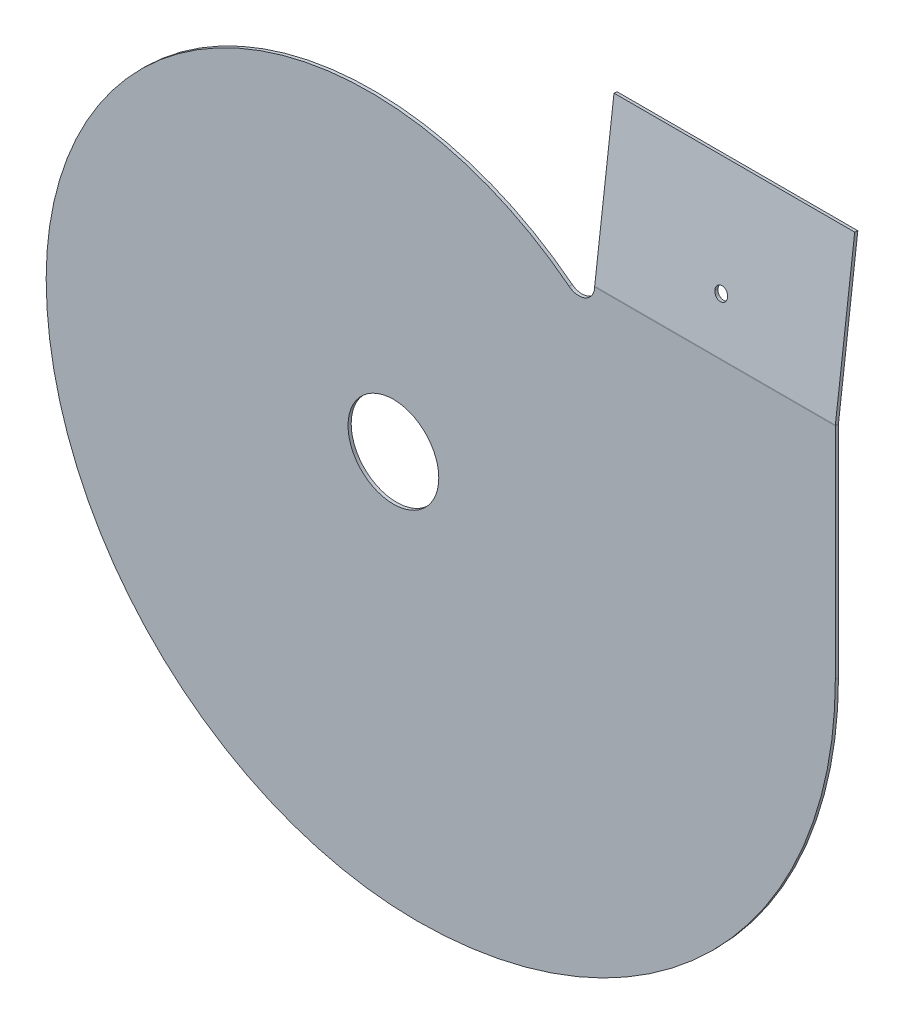
ISO-10303-21;
HEADER;
FILE_DESCRIPTION(('STEP AP214'),'2;1');
FILE_NAME('part.step','',(''),(''),'','','');
FILE_SCHEMA(('AUTOMOTIVE_DESIGN { 1 0 10303 214 1 1 1 1 }'));
ENDSEC;
DATA;
#1=APPLICATION_CONTEXT('core data for automotive mechanical design processes');
#2=APPLICATION_PROTOCOL_DEFINITION('international standard','automotive_design',2000,#1);
#3=PRODUCT_CONTEXT('',#1,'mechanical');
#4=PRODUCT('Part','Part','',(#3));
#5=PRODUCT_RELATED_PRODUCT_CATEGORY('part','',(#4));
#6=PRODUCT_DEFINITION_FORMATION('','',#4);
#7=PRODUCT_DEFINITION_CONTEXT('part definition',#1,'design');
#8=PRODUCT_DEFINITION('design','',#6,#7);
#9=PRODUCT_DEFINITION_SHAPE('','',#8);
#10=(LENGTH_UNIT() NAMED_UNIT(*) SI_UNIT(.MILLI.,.METRE.));
#11=(NAMED_UNIT(*) PLANE_ANGLE_UNIT() SI_UNIT($,.RADIAN.));
#12=(NAMED_UNIT(*) SI_UNIT($,.STERADIAN.) SOLID_ANGLE_UNIT());
#13=UNCERTAINTY_MEASURE_WITH_UNIT(LENGTH_MEASURE(1.E-05),#10,'distance_accuracy_value','');
#14=(GEOMETRIC_REPRESENTATION_CONTEXT(3) GLOBAL_UNCERTAINTY_ASSIGNED_CONTEXT((#13)) GLOBAL_UNIT_ASSIGNED_CONTEXT((#10,
#11,#12)) REPRESENTATION_CONTEXT('',''));
#15=CARTESIAN_POINT('',(0.,0.,0.));
#16=DIRECTION('',(0.,0.,1.));
#17=DIRECTION('',(1.,0.,0.));
#18=AXIS2_PLACEMENT_3D('',#15,#16,#17);
#19=CARTESIAN_POINT('',(255.,508.256089977836,-28.525118465794));
#20=DIRECTION('',(-1.,0.,0.));
#21=DIRECTION('',(0.,0.121869343405148,0.992546151641322));
#22=AXIS2_PLACEMENT_3D('',#19,#20,#21);
#23=PLANE('',#22);
#24=DIRECTION('',(0.,-0.992546151641322,0.121869343405148));
#25=VECTOR('',#24,1.);
#26=CARTESIAN_POINT('',(255.,508.256089977836,-28.525118465794));
#27=LINE('',#26,#25);
#28=CARTESIAN_POINT('',(255.,508.256089977836,-28.525118465794));
#29=VERTEX_POINT('',#28);
#30=CARTESIAN_POINT('',(255.,308.697149175057,-4.02236154507604));
#31=VERTEX_POINT('',#30);
#32=EDGE_CURVE('E370',#29,#31,#27,.T.);
#33=ORIENTED_EDGE('',*,*,#32,.T.);
#34=DIRECTION('',(0.,0.121869343405148,0.992546151641322));
#35=VECTOR('',#34,1.);
#36=CARTESIAN_POINT('',(255.,308.697149175057,-4.02236154507604));
#37=LINE('',#36,#35);
#38=CARTESIAN_POINT('',(255.,309.184626548678,-0.0521769385107493));
#39=VERTEX_POINT('',#38);
#40=EDGE_CURVE('E12',#31,#39,#37,.T.);
#41=ORIENTED_EDGE('',*,*,#40,.T.);
#42=DIRECTION('',(0.,-0.992546151641322,0.121869343405148));
#43=VECTOR('',#42,1.);
#44=CARTESIAN_POINT('',(255.,508.743567351456,-24.5549338592287));
#45=LINE('',#44,#43);
#46=CARTESIAN_POINT('',(255.,508.743567351456,-24.5549338592287));
#47=VERTEX_POINT('',#46);
#48=EDGE_CURVE('E421',#47,#39,#45,.T.);
#49=ORIENTED_EDGE('',*,*,#48,.F.);
#50=DIRECTION('',(0.,0.121869343405148,0.992546151641322));
#51=VECTOR('',#50,1.);
#52=CARTESIAN_POINT('',(255.,508.256089977836,-28.525118465794));
#53=LINE('',#52,#51);
#54=EDGE_CURVE('E374',#29,#47,#53,.T.);
#55=ORIENTED_EDGE('',*,*,#54,.F.);
#56=EDGE_LOOP('',(#33,#41,#49,#55));
#57=FACE_BOUND('',#56,.T.);
#58=ADVANCED_FACE('F49',(#57),#23,.T.);
#59=CARTESIAN_POINT('',(560.,31.8339371900013,29.9721663686769));
#60=DIRECTION('',(1.,0.,0.));
#61=DIRECTION('',(0.,-0.121869343405148,-0.992546151641322));
#62=AXIS2_PLACEMENT_3D('',#59,#60,#61);
#63=PLANE('',#62);
#64=DIRECTION('',(0.,0.992546151641322,-0.121869343405148));
#65=VECTOR('',#64,1.);
#66=CARTESIAN_POINT('',(560.,32.3214145636219,33.9423509752422));
#67=LINE('',#66,#65);
#68=CARTESIAN_POINT('',(560.,309.184626548678,-0.0521769385107493));
#69=VERTEX_POINT('',#68);
#70=CARTESIAN_POINT('',(560.,508.743567351456,-24.5549338592287));
#71=VERTEX_POINT('',#70);
#72=EDGE_CURVE('E283',#69,#71,#67,.T.);
#73=ORIENTED_EDGE('',*,*,#72,.F.);
#74=DIRECTION('',(0.,-0.121869343405148,-0.992546151641322));
#75=VECTOR('',#74,1.);
#76=CARTESIAN_POINT('',(560.,308.697149175057,-4.02236154507604));
#77=LINE('',#76,#75);
#78=CARTESIAN_POINT('',(560.,308.697149175057,-4.02236154507603));
#79=VERTEX_POINT('',#78);
#80=EDGE_CURVE('E395',#69,#79,#77,.T.);
#81=ORIENTED_EDGE('',*,*,#80,.T.);
#82=DIRECTION('',(0.,0.992546151641322,-0.121869343405148));
#83=VECTOR('',#82,1.);
#84=CARTESIAN_POINT('',(560.,31.8339371900013,29.9721663686769));
#85=LINE('',#84,#83);
#86=CARTESIAN_POINT('',(560.,508.256089977836,-28.525118465794));
#87=VERTEX_POINT('',#86);
#88=EDGE_CURVE('E52',#79,#87,#85,.T.);
#89=ORIENTED_EDGE('',*,*,#88,.T.);
#90=DIRECTION('',(0.,0.121869343405148,0.992546151641322));
#91=VECTOR('',#90,1.);
#92=CARTESIAN_POINT('',(560.,508.256089977836,-28.525118465794));
#93=LINE('',#92,#91);
#94=EDGE_CURVE('E378',#87,#71,#93,.T.);
#95=ORIENTED_EDGE('',*,*,#94,.T.);
#96=EDGE_LOOP('',(#73,#81,#89,#95));
#97=FACE_BOUND('',#96,.T.);
#98=ADVANCED_FACE('F358',(#97),#63,.T.);
#99=CARTESIAN_POINT('',(-30.,-27.2313545348574,41.2545115795511));
#100=DIRECTION('',(0.,0.121869343405148,0.992546151641322));
#101=DIRECTION('',(1.,0.,0.));
#102=AXIS2_PLACEMENT_3D('',#99,#100,#101);
#103=PLANE('',#102);
#104=CARTESIAN_POINT('',(407.5,373.,-7.88771954658621));
#105=DIRECTION('',(0.,0.121869343405148,0.992546151641322));
#106=DIRECTION('',(0.,0.992546151641322,-0.121869343405148));
#107=AXIS2_PLACEMENT_3D('',#104,#105,#106);
#108=ELLIPSE('',#107,8.06007860367077,7.99999999999999);
#109=CARTESIAN_POINT('',(415.496286103721,373.243738686815,-7.91764689422182));
#110=VERTEX_POINT('',#109);
#111=CARTESIAN_POINT('',(399.50371389628,373.243738686815,-7.91764689422182));
#112=VERTEX_POINT('',#111);
#113=EDGE_CURVE('E65',#110,#112,#108,.F.);
#114=ORIENTED_EDGE('',*,*,#113,.T.);
#115=CARTESIAN_POINT('',(407.5,373.487477373621,-7.94757424185634));
#116=DIRECTION('',(0.,0.121869343405148,0.992546151641322));
#117=DIRECTION('',(0.,0.992546151641322,-0.121869343405148));
#118=AXIS2_PLACEMENT_3D('',#115,#116,#117);
#119=ELLIPSE('',#118,8.06007860367077,7.99999999999999);
#120=EDGE_CURVE('E150',#112,#110,#119,.F.);
#121=ORIENTED_EDGE('',*,*,#120,.T.);
#122=EDGE_LOOP('',(#114,#121));
#123=FACE_BOUND('',#122,.T.);
#124=ORIENTED_EDGE('',*,*,#48,.T.);
#125=DIRECTION('',(1.,0.,0.));
#126=VECTOR('',#125,1.);
#127=CARTESIAN_POINT('',(-30.0000000000001,309.184626548678,-0.0521769385107493));
#128=LINE('',#127,#126);
#129=EDGE_CURVE('E57',#39,#69,#128,.T.);
#130=ORIENTED_EDGE('',*,*,#129,.T.);
#131=ORIENTED_EDGE('',*,*,#72,.T.);
#132=DIRECTION('',(-1.,0.,0.));
#133=VECTOR('',#132,1.);
#134=CARTESIAN_POINT('',(560.,508.743567351456,-24.5549338592287));
#135=LINE('',#134,#133);
#136=EDGE_CURVE('E418',#71,#47,#135,.T.);
#137=ORIENTED_EDGE('',*,*,#136,.T.);
#138=EDGE_LOOP('',(#124,#130,#131,#137));
#139=FACE_BOUND('',#138,.T.);
#140=ADVANCED_FACE('F155',(#123,#139),#103,.T.);
#141=CARTESIAN_POINT('',(560.,508.256089977836,-28.525118465794));
#142=DIRECTION('',(0.,0.992546151641322,-0.121869343405148));
#143=DIRECTION('',(0.,0.121869343405148,0.992546151641322));
#144=AXIS2_PLACEMENT_3D('',#141,#142,#143);
#145=PLANE('',#144);
#146=ORIENTED_EDGE('',*,*,#136,.F.);
#147=ORIENTED_EDGE('',*,*,#94,.F.);
#148=DIRECTION('',(-1.,0.,0.));
#149=VECTOR('',#148,1.);
#150=CARTESIAN_POINT('',(560.,508.256089977836,-28.525118465794));
#151=LINE('',#150,#149);
#152=EDGE_CURVE('E379',#87,#29,#151,.T.);
#153=ORIENTED_EDGE('',*,*,#152,.T.);
#154=ORIENTED_EDGE('',*,*,#54,.T.);
#155=EDGE_LOOP('',(#146,#147,#153,#154));
#156=FACE_BOUND('',#155,.T.);
#157=ADVANCED_FACE('F350',(#156),#145,.T.);
#158=CARTESIAN_POINT('',(-30.,-27.718831908478,37.2843269729858));
#159=DIRECTION('',(0.,0.121869343405148,0.992546151641322));
#160=DIRECTION('',(1.,0.,0.));
#161=AXIS2_PLACEMENT_3D('',#158,#159,#160);
#162=PLANE('',#161);
#163=CARTESIAN_POINT('',(407.5,373.,-11.9177588484216));
#164=DIRECTION('',(0.,0.121869343405148,0.992546151641322));
#165=DIRECTION('',(0.,0.992546151641322,-0.121869343405148));
#166=AXIS2_PLACEMENT_3D('',#163,#164,#165);
#167=ELLIPSE('',#166,8.06007860367077,7.99999999999999);
#168=CARTESIAN_POINT('',(399.50371389628,372.756261313194,-11.8878315007871));
#169=VERTEX_POINT('',#168);
#170=CARTESIAN_POINT('',(415.49628610372,372.756261313194,-11.8878315007871));
#171=VERTEX_POINT('',#170);
#172=EDGE_CURVE('E153',#169,#171,#167,.F.);
#173=ORIENTED_EDGE('',*,*,#172,.F.);
#174=CARTESIAN_POINT('',(407.5,372.512522626379,-11.8579041531515));
#175=DIRECTION('',(0.,0.121869343405148,0.992546151641322));
#176=DIRECTION('',(0.,0.992546151641322,-0.121869343405148));
#177=AXIS2_PLACEMENT_3D('',#174,#175,#176);
#178=ELLIPSE('',#177,8.06007860367077,7.99999999999999);
#179=EDGE_CURVE('E70',#171,#169,#178,.F.);
#180=ORIENTED_EDGE('',*,*,#179,.F.);
#181=EDGE_LOOP('',(#173,#180));
#182=FACE_BOUND('',#181,.T.);
#183=DIRECTION('',(1.,0.,0.));
#184=VECTOR('',#183,1.);
#185=CARTESIAN_POINT('',(-30.0000000000001,308.697149175057,-4.02236154507604));
#186=LINE('',#185,#184);
#187=EDGE_CURVE('E384',#31,#79,#186,.T.);
#188=ORIENTED_EDGE('',*,*,#187,.F.);
#189=ORIENTED_EDGE('',*,*,#32,.F.);
#190=ORIENTED_EDGE('',*,*,#152,.F.);
#191=ORIENTED_EDGE('',*,*,#88,.F.);
#192=EDGE_LOOP('',(#188,#189,#190,#191));
#193=FACE_BOUND('',#192,.T.);
#194=ADVANCED_FACE('F353',(#182,#193),#162,.F.);
#195=CARTESIAN_POINT('',(-30.,-30.,-4.));
#196=DIRECTION('',(0.,0.,1.));
#197=DIRECTION('',(1.,0.,0.));
#198=AXIS2_PLACEMENT_3D('',#195,#196,#197);
#199=CYLINDRICAL_SURFACE('',#198,410.);
#200=CARTESIAN_POINT('',(-30.,-30.,0.));
#201=DIRECTION('',(0.,0.,1.));
#202=DIRECTION('',(1.,0.,0.));
#203=AXIS2_PLACEMENT_3D('',#200,#201,#202);
#204=CIRCLE('',#203,410.);
#205=CARTESIAN_POINT('',(222.674418604651,292.886416844688,0.));
#206=VERTEX_POINT('',#205);
#207=CARTESIAN_POINT('',(-440.,-29.9999999999999,0.));
#208=VERTEX_POINT('',#207);
#209=EDGE_CURVE('E293',#206,#208,#204,.T.);
#210=ORIENTED_EDGE('',*,*,#209,.F.);
#211=DIRECTION('',(0.,0.,1.));
#212=VECTOR('',#211,1.);
#213=CARTESIAN_POINT('',(222.674418604651,292.886416844688,-4.));
#214=LINE('',#213,#212);
#215=CARTESIAN_POINT('',(222.674418604651,292.886416844688,-4.));
#216=VERTEX_POINT('',#215);
#217=EDGE_CURVE('E275',#216,#206,#214,.T.);
#218=ORIENTED_EDGE('',*,*,#217,.F.);
#219=CARTESIAN_POINT('',(-30.,-30.,-4.));
#220=DIRECTION('',(0.,0.,1.));
#221=DIRECTION('',(1.,0.,0.));
#222=AXIS2_PLACEMENT_3D('',#219,#220,#221);
#223=CIRCLE('',#222,410.);
#224=CARTESIAN_POINT('',(-440.,-29.9999999999999,-4.));
#225=VERTEX_POINT('',#224);
#226=EDGE_CURVE('E318',#216,#225,#223,.T.);
#227=ORIENTED_EDGE('',*,*,#226,.T.);
#228=DIRECTION('',(0.,0.,1.));
#229=VECTOR('',#228,1.);
#230=CARTESIAN_POINT('',(-440.,-29.9999999999999,-4.));
#231=LINE('',#230,#229);
#232=EDGE_CURVE('E316',#225,#208,#231,.T.);
#233=ORIENTED_EDGE('',*,*,#232,.T.);
#234=EDGE_LOOP('',(#210,#218,#227,#233));
#235=FACE_BOUND('',#234,.T.);
#236=ADVANCED_FACE('F234',(#235),#199,.T.);
#237=CARTESIAN_POINT('',(30.,-30.,-4.));
#238=DIRECTION('',(0.,0.,1.));
#239=DIRECTION('',(1.,0.,0.));
#240=AXIS2_PLACEMENT_3D('',#237,#238,#239);
#241=CYLINDRICAL_SURFACE('',#240,470.);
#242=CARTESIAN_POINT('',(30.,-30.,0.));
#243=DIRECTION('',(0.,0.,1.));
#244=DIRECTION('',(1.,0.,0.));
#245=AXIS2_PLACEMENT_3D('',#242,#243,#244);
#246=CIRCLE('',#245,470.);
#247=CARTESIAN_POINT('',(29.9999999999999,-500.,0.));
#248=VERTEX_POINT('',#247);
#249=EDGE_CURVE('E290',#208,#248,#246,.T.);
#250=ORIENTED_EDGE('',*,*,#249,.F.);
#251=ORIENTED_EDGE('',*,*,#232,.F.);
#252=CARTESIAN_POINT('',(30.,-30.,-4.));
#253=DIRECTION('',(0.,0.,1.));
#254=DIRECTION('',(1.,0.,0.));
#255=AXIS2_PLACEMENT_3D('',#252,#253,#254);
#256=CIRCLE('',#255,470.);
#257=CARTESIAN_POINT('',(29.9999999999999,-500.,-4.));
#258=VERTEX_POINT('',#257);
#259=EDGE_CURVE('E313',#225,#258,#256,.T.);
#260=ORIENTED_EDGE('',*,*,#259,.T.);
#261=DIRECTION('',(0.,0.,1.));
#262=VECTOR('',#261,1.);
#263=CARTESIAN_POINT('',(29.9999999999999,-500.,-4.));
#264=LINE('',#263,#262);
#265=EDGE_CURVE('E311',#258,#248,#264,.T.);
#266=ORIENTED_EDGE('',*,*,#265,.T.);
#267=EDGE_LOOP('',(#250,#251,#260,#266));
#268=FACE_BOUND('',#267,.T.);
#269=ADVANCED_FACE('F435',(#268),#241,.T.);
#270=CARTESIAN_POINT('',(30.,30.,-4.));
#271=DIRECTION('',(0.,0.,1.));
#272=DIRECTION('',(1.,0.,0.));
#273=AXIS2_PLACEMENT_3D('',#270,#271,#272);
#274=CYLINDRICAL_SURFACE('',#273,530.);
#275=CARTESIAN_POINT('',(30.,30.,0.));
#276=DIRECTION('',(0.,0.,1.));
#277=DIRECTION('',(1.,0.,0.));
#278=AXIS2_PLACEMENT_3D('',#275,#276,#277);
#279=CIRCLE('',#278,530.);
#280=CARTESIAN_POINT('',(560.,30.,0.));
#281=VERTEX_POINT('',#280);
#282=EDGE_CURVE('E287',#248,#281,#279,.T.);
#283=ORIENTED_EDGE('',*,*,#282,.F.);
#284=ORIENTED_EDGE('',*,*,#265,.F.);
#285=CARTESIAN_POINT('',(30.,30.,-4.));
#286=DIRECTION('',(0.,0.,1.));
#287=DIRECTION('',(1.,0.,0.));
#288=AXIS2_PLACEMENT_3D('',#285,#286,#287);
#289=CIRCLE('',#288,530.);
#290=CARTESIAN_POINT('',(560.,30.,-4.));
#291=VERTEX_POINT('',#290);
#292=EDGE_CURVE('E308',#258,#291,#289,.T.);
#293=ORIENTED_EDGE('',*,*,#292,.T.);
#294=DIRECTION('',(0.,0.,1.));
#295=VECTOR('',#294,1.);
#296=CARTESIAN_POINT('',(560.,30.,-4.));
#297=LINE('',#296,#295);
#298=EDGE_CURVE('E306',#291,#281,#297,.T.);
#299=ORIENTED_EDGE('',*,*,#298,.T.);
#300=EDGE_LOOP('',(#283,#284,#293,#299));
#301=FACE_BOUND('',#300,.T.);
#302=ADVANCED_FACE('F437',(#301),#274,.T.);
#303=CARTESIAN_POINT('',(0.,0.,6.));
#304=DIRECTION('',(0.,0.,-1.));
#305=DIRECTION('',(-1.,0.,0.));
#306=AXIS2_PLACEMENT_3D('',#303,#304,#305);
#307=CYLINDRICAL_SURFACE('',#306,57.5);
#308=CARTESIAN_POINT('',(0.,0.,0.));
#309=DIRECTION('',(0.,0.,1.));
#310=DIRECTION('',(1.,0.,0.));
#311=AXIS2_PLACEMENT_3D('',#308,#309,#310);
#312=CIRCLE('',#311,57.5);
#313=CARTESIAN_POINT('',(57.5,0.,0.));
#314=VERTEX_POINT('',#313);
#315=EDGE_CURVE('E303',#314,#314,#312,.T.);
#316=ORIENTED_EDGE('',*,*,#315,.T.);
#317=EDGE_LOOP('',(#316));
#318=FACE_BOUND('',#317,.T.);
#319=CARTESIAN_POINT('',(0.,0.,-4.));
#320=DIRECTION('',(0.,0.,-1.));
#321=DIRECTION('',(-1.,0.,0.));
#322=AXIS2_PLACEMENT_3D('',#319,#320,#321);
#323=CIRCLE('',#322,57.5);
#324=CARTESIAN_POINT('',(-57.5,0.,-4.));
#325=VERTEX_POINT('',#324);
#326=EDGE_CURVE('E300',#325,#325,#323,.T.);
#327=ORIENTED_EDGE('',*,*,#326,.T.);
#328=EDGE_LOOP('',(#327));
#329=FACE_BOUND('',#328,.T.);
#330=ADVANCED_FACE('F439',(#318,#329),#307,.F.);
#331=CARTESIAN_POINT('',(-30.,-30.,-4.));
#332=DIRECTION('',(0.,0.,1.));
#333=DIRECTION('',(1.,0.,0.));
#334=AXIS2_PLACEMENT_3D('',#331,#332,#333);
#335=PLANE('',#334);
#336=ORIENTED_EDGE('',*,*,#326,.F.);
#337=EDGE_LOOP('',(#336));
#338=FACE_BOUND('',#337,.T.);
#339=CARTESIAN_POINT('',(235.,308.636973763941,-4.));
#340=DIRECTION('',(0.,0.,-1.));
#341=DIRECTION('',(1.,0.,0.));
#342=AXIS2_PLACEMENT_3D('',#339,#340,#341);
#343=CIRCLE('',#342,20.);
#344=CARTESIAN_POINT('',(254.997667636882,308.331541144842,-4.));
#345=VERTEX_POINT('',#344);
#346=EDGE_CURVE('E284',#345,#216,#343,.T.);
#347=ORIENTED_EDGE('',*,*,#346,.F.);
#348=DIRECTION('',(1.,0.,0.));
#349=VECTOR('',#348,1.);
#350=CARTESIAN_POINT('',(-30.0000000000001,308.331541144842,-4.));
#351=LINE('',#350,#349);
#352=CARTESIAN_POINT('',(560.,308.331541144842,-4.));
#353=VERTEX_POINT('',#352);
#354=EDGE_CURVE('E299',#345,#353,#351,.T.);
#355=ORIENTED_EDGE('',*,*,#354,.T.);
#356=DIRECTION('',(0.,1.,0.));
#357=VECTOR('',#356,1.);
#358=CARTESIAN_POINT('',(560.,30.,-4.));
#359=LINE('',#358,#357);
#360=EDGE_CURVE('E297',#291,#353,#359,.T.);
#361=ORIENTED_EDGE('',*,*,#360,.F.);
#362=ORIENTED_EDGE('',*,*,#292,.F.);
#363=ORIENTED_EDGE('',*,*,#259,.F.);
#364=ORIENTED_EDGE('',*,*,#226,.F.);
#365=EDGE_LOOP('',(#347,#355,#361,#362,#363,#364));
#366=FACE_BOUND('',#365,.T.);
#367=ADVANCED_FACE('F408',(#338,#366),#335,.F.);
#368=CARTESIAN_POINT('',(560.,30.,-4.));
#369=DIRECTION('',(1.,0.,0.));
#370=DIRECTION('',(0.,0.,-1.));
#371=AXIS2_PLACEMENT_3D('',#368,#369,#370);
#372=PLANE('',#371);
#373=DIRECTION('',(0.,0.,-1.));
#374=VECTOR('',#373,1.);
#375=CARTESIAN_POINT('',(560.,308.331541144842,-4.));
#376=LINE('',#375,#374);
#377=CARTESIAN_POINT('',(560.,308.331541144842,0.));
#378=VERTEX_POINT('',#377);
#379=EDGE_CURVE('E321',#378,#353,#376,.T.);
#380=ORIENTED_EDGE('',*,*,#379,.F.);
#381=DIRECTION('',(0.,1.,0.));
#382=VECTOR('',#381,1.);
#383=CARTESIAN_POINT('',(560.,30.,0.));
#384=LINE('',#383,#382);
#385=EDGE_CURVE('E285',#281,#378,#384,.T.);
#386=ORIENTED_EDGE('',*,*,#385,.F.);
#387=ORIENTED_EDGE('',*,*,#298,.F.);
#388=ORIENTED_EDGE('',*,*,#360,.T.);
#389=EDGE_LOOP('',(#380,#386,#387,#388));
#390=FACE_BOUND('',#389,.T.);
#391=ADVANCED_FACE('F403',(#390),#372,.T.);
#392=CARTESIAN_POINT('',(-30.,-30.,0.));
#393=DIRECTION('',(0.,0.,1.));
#394=DIRECTION('',(1.,0.,0.));
#395=AXIS2_PLACEMENT_3D('',#392,#393,#394);
#396=PLANE('',#395);
#397=DIRECTION('',(1.,0.,0.));
#398=VECTOR('',#397,1.);
#399=CARTESIAN_POINT('',(-30.0000000000001,308.331541144842,0.));
#400=LINE('',#399,#398);
#401=CARTESIAN_POINT('',(254.997667636882,308.331541144842,0.));
#402=VERTEX_POINT('',#401);
#403=EDGE_CURVE('E324',#402,#378,#400,.T.);
#404=ORIENTED_EDGE('',*,*,#403,.F.);
#405=CARTESIAN_POINT('',(235.,308.636973763941,0.));
#406=DIRECTION('',(0.,0.,-1.));
#407=DIRECTION('',(1.,0.,0.));
#408=AXIS2_PLACEMENT_3D('',#405,#406,#407);
#409=CIRCLE('',#408,20.);
#410=EDGE_CURVE('E296',#402,#206,#409,.T.);
#411=ORIENTED_EDGE('',*,*,#410,.T.);
#412=ORIENTED_EDGE('',*,*,#209,.T.);
#413=ORIENTED_EDGE('',*,*,#249,.T.);
#414=ORIENTED_EDGE('',*,*,#282,.T.);
#415=ORIENTED_EDGE('',*,*,#385,.T.);
#416=EDGE_LOOP('',(#404,#411,#412,#413,#414,#415));
#417=FACE_BOUND('',#416,.T.);
#418=ORIENTED_EDGE('',*,*,#315,.F.);
#419=EDGE_LOOP('',(#418));
#420=FACE_BOUND('',#419,.T.);
#421=ADVANCED_FACE('F348',(#417,#420),#396,.T.);
#422=CARTESIAN_POINT('',(235.,308.636973763941,-4.));
#423=DIRECTION('',(0.,0.,1.));
#424=DIRECTION('',(1.,0.,0.));
#425=AXIS2_PLACEMENT_3D('',#422,#423,#424);
#426=CYLINDRICAL_SURFACE('',#425,20.);
#427=CARTESIAN_POINT('',(254.997667636882,308.331541144842,-4.));
#428=CARTESIAN_POINT('',(254.997667636882,308.331541144842,0.));
#429=B_SPLINE_CURVE_WITH_KNOTS('',1,(#427,#428),.UNSPECIFIED.,.F.,.F.,(2,2),(0.,1.),.UNSPECIFIED.);
#430=EDGE_CURVE('E271',#345,#402,#429,.T.);
#431=ORIENTED_EDGE('',*,*,#430,.F.);
#432=ORIENTED_EDGE('',*,*,#346,.T.);
#433=ORIENTED_EDGE('',*,*,#217,.T.);
#434=ORIENTED_EDGE('',*,*,#410,.F.);
#435=EDGE_LOOP('',(#431,#432,#433,#434));
#436=FACE_BOUND('',#435,.T.);
#437=ADVANCED_FACE('F338',(#436),#426,.F.);
#438=CARTESIAN_POINT('',(255.,308.331541144842,-7.));
#439=DIRECTION('',(1.,0.,0.));
#440=DIRECTION('',(0.,0.,-1.));
#441=AXIS2_PLACEMENT_3D('',#438,#439,#440);
#442=PLANE('',#441);
#443=CARTESIAN_POINT('',(255.,308.758880921586,-0.0130564110469369));
#444=CARTESIAN_POINT('',(255.,308.514686763446,-4.0055956047344));
#445=B_SPLINE_CURVE_WITH_KNOTS('',1,(#443,#444),.UNSPECIFIED.,.F.,.F.,(2,2),(0.,1.),.UNSPECIFIED.);
#446=CARTESIAN_POINT('',(255.,308.758880921586,-0.0130564110469291));
#447=VERTEX_POINT('',#446);
#448=CARTESIAN_POINT('',(255.,308.514686763446,-4.0055956047344));
#449=VERTEX_POINT('',#448);
#450=EDGE_CURVE('E261',#447,#449,#445,.T.);
#451=ORIENTED_EDGE('',*,*,#450,.F.);
#452=CARTESIAN_POINT('',(255.,308.331541144842,-7.));
#453=DIRECTION('',(1.,0.,0.));
#454=DIRECTION('',(0.,1.,0.));
#455=AXIS2_PLACEMENT_3D('',#452,#453,#454);
#456=CIRCLE('',#455,7.);
#457=EDGE_CURVE('E158',#447,#39,#456,.F.);
#458=ORIENTED_EDGE('',*,*,#457,.T.);
#459=ORIENTED_EDGE('',*,*,#40,.F.);
#460=CARTESIAN_POINT('',(255.,308.331541144842,-7.));
#461=DIRECTION('',(-1.,0.,0.));
#462=DIRECTION('',(0.,0.,-1.));
#463=AXIS2_PLACEMENT_3D('',#460,#461,#462);
#464=CIRCLE('',#463,3.);
#465=EDGE_CURVE('E381',#449,#31,#464,.T.);
#466=ORIENTED_EDGE('',*,*,#465,.F.);
#467=EDGE_LOOP('',(#451,#458,#459,#466));
#468=FACE_BOUND('',#467,.T.);
#469=ADVANCED_FACE('F232',(#468),#442,.F.);
#470=CARTESIAN_POINT('',(560.,308.331541144842,-7.));
#471=DIRECTION('',(-1.,0.,0.));
#472=DIRECTION('',(0.,0.,1.));
#473=AXIS2_PLACEMENT_3D('',#470,#471,#472);
#474=PLANE('',#473);
#475=ORIENTED_EDGE('',*,*,#80,.F.);
#476=CARTESIAN_POINT('',(560.,308.331541144842,-7.));
#477=DIRECTION('',(1.,0.,0.));
#478=DIRECTION('',(0.,1.,0.));
#479=AXIS2_PLACEMENT_3D('',#476,#477,#478);
#480=CIRCLE('',#479,7.);
#481=EDGE_CURVE('E386',#69,#378,#480,.T.);
#482=ORIENTED_EDGE('',*,*,#481,.T.);
#483=ORIENTED_EDGE('',*,*,#379,.T.);
#484=CARTESIAN_POINT('',(560.,308.331541144842,-7.));
#485=DIRECTION('',(1.,0.,0.));
#486=DIRECTION('',(0.,0.,1.));
#487=AXIS2_PLACEMENT_3D('',#484,#485,#486);
#488=CIRCLE('',#487,3.);
#489=EDGE_CURVE('E163',#79,#353,#488,.T.);
#490=ORIENTED_EDGE('',*,*,#489,.F.);
#491=EDGE_LOOP('',(#475,#482,#483,#490));
#492=FACE_BOUND('',#491,.T.);
#493=ADVANCED_FACE('F231',(#492),#474,.F.);
#494=CARTESIAN_POINT('',(254.997667636882,308.331541144842,0.));
#495=CARTESIAN_POINT('',(254.998445091585,308.474076427714,0.));
#496=CARTESIAN_POINT('',(254.999222545297,308.616611495749,-0.00435484019544299));
#497=CARTESIAN_POINT('',(255.,308.758880921586,-0.0130564110469369));
#498=CARTESIAN_POINT('',(254.997667636882,308.331541144842,-4.));
#499=CARTESIAN_POINT('',(254.998445091585,308.392627694641,-4.));
#500=CARTESIAN_POINT('',(254.999222545297,308.453714152377,-4.00186636008396));
#501=CARTESIAN_POINT('',(255.,308.514686763446,-4.0055956047344));
#502=B_SPLINE_SURFACE_WITH_KNOTS('',1,3,((#494,#495,#496,#497),(#498,#499,#500,#501)),
.UNSPECIFIED.,.F.,.F.,.F.,(2,2),(4,4),(0.,1.),(0.,1.),.UNSPECIFIED.);
#503=CARTESIAN_POINT('',(254.997667636882,308.331541144842,0.));
#504=CARTESIAN_POINT('',(254.998445091585,308.474076427714,0.));
#505=CARTESIAN_POINT('',(254.999222545297,308.616611495749,-0.00435484019544299));
#506=CARTESIAN_POINT('',(255.,308.758880921586,-0.0130564110469369));
#507=B_SPLINE_CURVE_WITH_KNOTS('',3,(#503,#504,#505,#506),.UNSPECIFIED.,.F.,.F.,(4,4),(0.,1.),.UNSPECIFIED.);
#508=EDGE_CURVE('E203',#402,#447,#507,.T.);
#509=CARTESIAN_POINT('',(255.,308.514686763446,-4.0055956047344));
#510=CARTESIAN_POINT('',(254.999222545297,308.453714152377,-4.00186636008396));
#511=CARTESIAN_POINT('',(254.998445091585,308.392627694641,-4.));
#512=CARTESIAN_POINT('',(254.997667636882,308.331541144842,-4.));
#513=B_SPLINE_CURVE_WITH_KNOTS('',3,(#509,#510,#511,#512),.UNSPECIFIED.,.F.,.F.,(4,4),(0.,1.),.UNSPECIFIED.);
#514=EDGE_CURVE('E196',#345,#449,#513,.F.);
#515=ORIENTED_EDGE('',*,*,#508,.T.);
#516=ORIENTED_EDGE('',*,*,#450,.T.);
#517=ORIENTED_EDGE('',*,*,#514,.F.);
#518=ORIENTED_EDGE('',*,*,#430,.T.);
#519=EDGE_LOOP('',(#515,#516,#517,#518));
#520=FACE_BOUND('',#519,.T.);
#521=ADVANCED_FACE('F175',(#520),#502,.F.);
#522=CARTESIAN_POINT('',(102.469661601616,308.331541144842,-7.));
#523=DIRECTION('',(1.,0.,0.));
#524=DIRECTION('',(0.,1.,0.));
#525=AXIS2_PLACEMENT_3D('',#522,#523,#524);
#526=CYLINDRICAL_SURFACE('',#525,3.);
#527=ORIENTED_EDGE('',*,*,#354,.F.);
#528=ORIENTED_EDGE('',*,*,#514,.T.);
#529=ORIENTED_EDGE('',*,*,#465,.T.);
#530=ORIENTED_EDGE('',*,*,#187,.T.);
#531=ORIENTED_EDGE('',*,*,#489,.T.);
#532=EDGE_LOOP('',(#527,#528,#529,#530,#531));
#533=FACE_BOUND('',#532,.T.);
#534=ADVANCED_FACE('F171',(#533),#526,.F.);
#535=CARTESIAN_POINT('',(102.469661601616,308.331541144842,-7.));
#536=DIRECTION('',(1.,0.,0.));
#537=DIRECTION('',(0.,1.,0.));
#538=AXIS2_PLACEMENT_3D('',#535,#536,#537);
#539=CYLINDRICAL_SURFACE('',#538,7.);
#540=ORIENTED_EDGE('',*,*,#403,.T.);
#541=ORIENTED_EDGE('',*,*,#481,.F.);
#542=ORIENTED_EDGE('',*,*,#129,.F.);
#543=ORIENTED_EDGE('',*,*,#457,.F.);
#544=ORIENTED_EDGE('',*,*,#508,.F.);
#545=EDGE_LOOP('',(#540,#541,#542,#543,#544));
#546=FACE_BOUND('',#545,.T.);
#547=ADVANCED_FACE('F169',(#546),#539,.T.);
#548=CARTESIAN_POINT('',(407.5,373.,-7.88771954658621));
#549=DIRECTION('',(0.,0.121869343405148,0.992546151641322));
#550=DIRECTION('',(0.,0.992546151641322,-0.121869343405148));
#551=AXIS2_PLACEMENT_3D('',#548,#549,#550);
#552=ELLIPSE('',#551,8.06007860367077,7.99999999999999);
#553=DIRECTION('',(0.,0.121869343405148,0.992546151641322));
#554=VECTOR('',#553,1.);
#555=SURFACE_OF_LINEAR_EXTRUSION('',#552,#554);
#556=DIRECTION('',(0.,0.121869343405148,0.992546151641322));
#557=VECTOR('',#556,1.);
#558=CARTESIAN_POINT('',(399.50371389628,372.75626131319,-11.8878315007866));
#559=LINE('',#558,#557);
#560=EDGE_CURVE('E142',#169,#112,#559,.T.);
#561=ORIENTED_EDGE('',*,*,#560,.T.);
#562=ORIENTED_EDGE('',*,*,#113,.F.);
#563=DIRECTION('',(0.,0.121869343405148,0.992546151641322));
#564=VECTOR('',#563,1.);
#565=CARTESIAN_POINT('',(415.49628610372,372.756261313189,-11.8878315007865));
#566=LINE('',#565,#564);
#567=EDGE_CURVE('E147',#110,#171,#566,.F.);
#568=ORIENTED_EDGE('',*,*,#567,.T.);
#569=ORIENTED_EDGE('',*,*,#179,.T.);
#570=EDGE_LOOP('',(#561,#562,#568,#569));
#571=FACE_BOUND('',#570,.T.);
#572=ADVANCED_FACE('F144',(#571),#555,.F.);
#573=CARTESIAN_POINT('',(407.5,373.,-11.9177588484216));
#574=DIRECTION('',(0.,0.121869343405148,0.992546151641322));
#575=DIRECTION('',(0.,0.992546151641322,-0.121869343405148));
#576=AXIS2_PLACEMENT_3D('',#573,#574,#575);
#577=ELLIPSE('',#576,8.06007860367077,7.99999999999999);
#578=DIRECTION('',(0.,0.121869343405148,0.992546151641322));
#579=VECTOR('',#578,1.);
#580=SURFACE_OF_LINEAR_EXTRUSION('',#577,#579);
#581=ORIENTED_EDGE('',*,*,#172,.T.);
#582=ORIENTED_EDGE('',*,*,#567,.F.);
#583=ORIENTED_EDGE('',*,*,#120,.F.);
#584=ORIENTED_EDGE('',*,*,#560,.F.);
#585=EDGE_LOOP('',(#581,#582,#583,#584));
#586=FACE_BOUND('',#585,.T.);
#587=ADVANCED_FACE('F151',(#586),#580,.F.);
#588=CLOSED_SHELL('',(#58,#98,#140,#157,#194,#236,#269,#302,#330,#367,#391,#421,#437,#469,#493,
#521,#534,#547,#572,#587));
#589=MANIFOLD_SOLID_BREP('B2',#588);
#590=ADVANCED_BREP_SHAPE_REPRESENTATION('',(#18,#589),#14);
#591=SHAPE_DEFINITION_REPRESENTATION(#9,#590);
ENDSEC;
END-ISO-10303-21;
